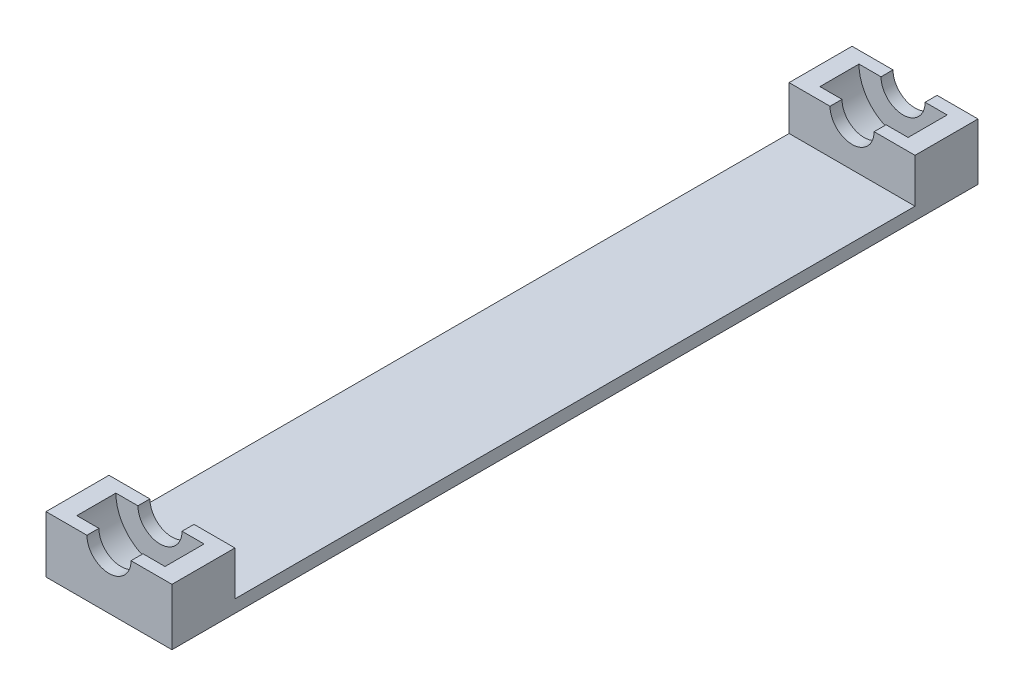
ISO-10303-21;
HEADER;
FILE_DESCRIPTION(('STEP AP214'),'2;1');
FILE_NAME('part.step','',(''),(''),'','','');
FILE_SCHEMA(('AUTOMOTIVE_DESIGN { 1 0 10303 214 1 1 1 1 }'));
ENDSEC;
DATA;
#1=APPLICATION_CONTEXT('core data for automotive mechanical design processes');
#2=APPLICATION_PROTOCOL_DEFINITION('international standard','automotive_design',2000,#1);
#3=PRODUCT_CONTEXT('',#1,'mechanical');
#4=PRODUCT('Part','Part','',(#3));
#5=PRODUCT_RELATED_PRODUCT_CATEGORY('part','',(#4));
#6=PRODUCT_DEFINITION_FORMATION('','',#4);
#7=PRODUCT_DEFINITION_CONTEXT('part definition',#1,'design');
#8=PRODUCT_DEFINITION('design','',#6,#7);
#9=PRODUCT_DEFINITION_SHAPE('','',#8);
#10=(LENGTH_UNIT() NAMED_UNIT(*) SI_UNIT(.MILLI.,.METRE.));
#11=(NAMED_UNIT(*) PLANE_ANGLE_UNIT() SI_UNIT($,.RADIAN.));
#12=(NAMED_UNIT(*) SI_UNIT($,.STERADIAN.) SOLID_ANGLE_UNIT());
#13=UNCERTAINTY_MEASURE_WITH_UNIT(LENGTH_MEASURE(1.E-05),#10,'distance_accuracy_value','');
#14=(GEOMETRIC_REPRESENTATION_CONTEXT(3) GLOBAL_UNCERTAINTY_ASSIGNED_CONTEXT((#13)) GLOBAL_UNIT_ASSIGNED_CONTEXT((#10,
#11,#12)) REPRESENTATION_CONTEXT('',''));
#15=CARTESIAN_POINT('',(0.,0.,0.));
#16=DIRECTION('',(0.,0.,1.));
#17=DIRECTION('',(1.,0.,0.));
#18=AXIS2_PLACEMENT_3D('',#15,#16,#17);
#19=CARTESIAN_POINT('',(10.,4.,0.));
#20=DIRECTION('',(0.,1.,0.));
#21=DIRECTION('',(0.,0.,1.));
#22=AXIS2_PLACEMENT_3D('',#19,#20,#21);
#23=PLANE('',#22);
#24=DIRECTION('',(-1.,0.,0.));
#25=VECTOR('',#24,1.);
#26=CARTESIAN_POINT('',(10.,4.,-32.));
#27=LINE('',#26,#25);
#28=CARTESIAN_POINT('',(10.,4.,-32.));
#29=VERTEX_POINT('',#28);
#30=CARTESIAN_POINT('',(6.74999999999996,4.,-32.));
#31=VERTEX_POINT('',#30);
#32=EDGE_CURVE('E167',#29,#31,#27,.T.);
#33=ORIENTED_EDGE('',*,*,#32,.T.);
#34=DIRECTION('',(0.,0.,-1.));
#35=VECTOR('',#34,1.);
#36=CARTESIAN_POINT('',(6.74999999999996,4.,-22.9));
#37=LINE('',#36,#35);
#38=CARTESIAN_POINT('',(6.74999999999996,4.,-31.05));
#39=VERTEX_POINT('',#38);
#40=EDGE_CURVE('E377',#31,#39,#37,.F.);
#41=ORIENTED_EDGE('',*,*,#40,.T.);
#42=DIRECTION('',(-1.,0.,0.));
#43=VECTOR('',#42,1.);
#44=CARTESIAN_POINT('',(10.,4.,-31.05));
#45=LINE('',#44,#43);
#46=CARTESIAN_POINT('',(8.49999999999996,4.,-31.05));
#47=VERTEX_POINT('',#46);
#48=EDGE_CURVE('E252',#47,#39,#45,.T.);
#49=ORIENTED_EDGE('',*,*,#48,.F.);
#50=DIRECTION('',(0.,0.,-1.));
#51=VECTOR('',#50,1.);
#52=CARTESIAN_POINT('',(8.49999999999996,4.,-27.95));
#53=LINE('',#52,#51);
#54=CARTESIAN_POINT('',(8.49999999999996,4.,-27.95));
#55=VERTEX_POINT('',#54);
#56=EDGE_CURVE('E11',#47,#55,#53,.F.);
#57=ORIENTED_EDGE('',*,*,#56,.T.);
#58=DIRECTION('',(-1.,0.,0.));
#59=VECTOR('',#58,1.);
#60=CARTESIAN_POINT('',(10.,4.,-27.95));
#61=LINE('',#60,#59);
#62=CARTESIAN_POINT('',(6.74999999999996,4.,-27.95));
#63=VERTEX_POINT('',#62);
#64=EDGE_CURVE('E51',#55,#63,#61,.T.);
#65=ORIENTED_EDGE('',*,*,#64,.T.);
#66=CARTESIAN_POINT('',(6.74999999999996,4.,-27.));
#67=VERTEX_POINT('',#66);
#68=EDGE_CURVE('E277',#63,#67,#37,.F.);
#69=ORIENTED_EDGE('',*,*,#68,.T.);
#70=DIRECTION('',(-1.,0.,0.));
#71=VECTOR('',#70,1.);
#72=CARTESIAN_POINT('',(10.,4.,-27.));
#73=LINE('',#72,#71);
#74=CARTESIAN_POINT('',(10.,4.,-27.));
#75=VERTEX_POINT('',#74);
#76=EDGE_CURVE('E203',#75,#67,#73,.T.);
#77=ORIENTED_EDGE('',*,*,#76,.F.);
#78=DIRECTION('',(0.,0.,-1.));
#79=VECTOR('',#78,1.);
#80=CARTESIAN_POINT('',(10.,4.,0.));
#81=LINE('',#80,#79);
#82=EDGE_CURVE('E179',#75,#29,#81,.T.);
#83=ORIENTED_EDGE('',*,*,#82,.T.);
#84=EDGE_LOOP('',(#33,#41,#49,#57,#65,#69,#77,#83));
#85=FACE_BOUND('',#84,.T.);
#86=ADVANCED_FACE('F41',(#85),#23,.T.);
#87=CARTESIAN_POINT('',(3.25000000000004,4.,-27.));
#88=VERTEX_POINT('',#87);
#89=CARTESIAN_POINT('',(0.,4.,-27.));
#90=VERTEX_POINT('',#89);
#91=EDGE_CURVE('E202',#88,#90,#73,.T.);
#92=ORIENTED_EDGE('',*,*,#91,.F.);
#93=DIRECTION('',(0.,0.,-1.));
#94=VECTOR('',#93,1.);
#95=CARTESIAN_POINT('',(3.25000000000004,4.,-22.9));
#96=LINE('',#95,#94);
#97=CARTESIAN_POINT('',(3.25000000000004,4.,-27.95));
#98=VERTEX_POINT('',#97);
#99=EDGE_CURVE('E437',#88,#98,#96,.T.);
#100=ORIENTED_EDGE('',*,*,#99,.T.);
#101=CARTESIAN_POINT('',(1.50000000000004,4.,-27.95));
#102=VERTEX_POINT('',#101);
#103=EDGE_CURVE('E251',#98,#102,#61,.T.);
#104=ORIENTED_EDGE('',*,*,#103,.T.);
#105=DIRECTION('',(0.,0.,-1.));
#106=VECTOR('',#105,1.);
#107=CARTESIAN_POINT('',(1.50000000000004,4.,-27.95));
#108=LINE('',#107,#106);
#109=CARTESIAN_POINT('',(1.50000000000004,4.,-31.05));
#110=VERTEX_POINT('',#109);
#111=EDGE_CURVE('E255',#102,#110,#108,.T.);
#112=ORIENTED_EDGE('',*,*,#111,.T.);
#113=CARTESIAN_POINT('',(3.25000000000004,4.,-31.05));
#114=VERTEX_POINT('',#113);
#115=EDGE_CURVE('E247',#114,#110,#45,.T.);
#116=ORIENTED_EDGE('',*,*,#115,.F.);
#117=CARTESIAN_POINT('',(3.25000000000004,4.,-32.));
#118=VERTEX_POINT('',#117);
#119=EDGE_CURVE('E431',#114,#118,#96,.T.);
#120=ORIENTED_EDGE('',*,*,#119,.T.);
#121=CARTESIAN_POINT('',(0.,4.,-32.));
#122=VERTEX_POINT('',#121);
#123=EDGE_CURVE('E207',#118,#122,#27,.T.);
#124=ORIENTED_EDGE('',*,*,#123,.T.);
#125=DIRECTION('',(0.,0.,-1.));
#126=VECTOR('',#125,1.);
#127=CARTESIAN_POINT('',(0.,4.,0.));
#128=LINE('',#127,#126);
#129=EDGE_CURVE('E191',#90,#122,#128,.T.);
#130=ORIENTED_EDGE('',*,*,#129,.F.);
#131=EDGE_LOOP('',(#92,#100,#104,#112,#116,#120,#124,#130));
#132=FACE_BOUND('',#131,.T.);
#133=ADVANCED_FACE('F430',(#132),#23,.T.);
#134=CARTESIAN_POINT('',(10.,3.99999999999996,0.));
#135=DIRECTION('',(0.,-1.,0.));
#136=DIRECTION('',(0.,0.,-1.));
#137=AXIS2_PLACEMENT_3D('',#134,#135,#136);
#138=PLANE('',#137);
#139=DIRECTION('',(-1.,0.,0.));
#140=VECTOR('',#139,1.);
#141=CARTESIAN_POINT('',(10.,3.99999999999999,27.));
#142=LINE('',#141,#140);
#143=CARTESIAN_POINT('',(10.,3.99999999999999,27.));
#144=VERTEX_POINT('',#143);
#145=CARTESIAN_POINT('',(6.74999999999996,3.99999999999999,27.));
#146=VERTEX_POINT('',#145);
#147=EDGE_CURVE('E123',#144,#146,#142,.T.);
#148=ORIENTED_EDGE('',*,*,#147,.T.);
#149=DIRECTION('',(0.,0.,1.));
#150=VECTOR('',#149,1.);
#151=CARTESIAN_POINT('',(6.74999999999996,3.99999999999999,22.9));
#152=LINE('',#151,#150);
#153=CARTESIAN_POINT('',(6.74999999999996,4.,27.95));
#154=VERTEX_POINT('',#153);
#155=EDGE_CURVE('E305',#146,#154,#152,.T.);
#156=ORIENTED_EDGE('',*,*,#155,.T.);
#157=DIRECTION('',(-1.,0.,0.));
#158=VECTOR('',#157,1.);
#159=CARTESIAN_POINT('',(10.,3.99999999999999,27.95));
#160=LINE('',#159,#158);
#161=CARTESIAN_POINT('',(8.49999999999996,3.99999999999999,27.95));
#162=VERTEX_POINT('',#161);
#163=EDGE_CURVE('E239',#162,#154,#160,.T.);
#164=ORIENTED_EDGE('',*,*,#163,.F.);
#165=DIRECTION('',(0.,0.,1.));
#166=VECTOR('',#165,1.);
#167=CARTESIAN_POINT('',(8.49999999999996,3.99999999999999,27.95));
#168=LINE('',#167,#166);
#169=CARTESIAN_POINT('',(8.49999999999996,4.,31.05));
#170=VERTEX_POINT('',#169);
#171=EDGE_CURVE('E243',#162,#170,#168,.T.);
#172=ORIENTED_EDGE('',*,*,#171,.T.);
#173=DIRECTION('',(-1.,0.,0.));
#174=VECTOR('',#173,1.);
#175=CARTESIAN_POINT('',(10.,4.,31.05));
#176=LINE('',#175,#174);
#177=CARTESIAN_POINT('',(6.74999999999996,4.,31.05));
#178=VERTEX_POINT('',#177);
#179=EDGE_CURVE('E235',#170,#178,#176,.T.);
#180=ORIENTED_EDGE('',*,*,#179,.T.);
#181=CARTESIAN_POINT('',(6.74999999999996,3.99999999999999,32.));
#182=VERTEX_POINT('',#181);
#183=EDGE_CURVE('E298',#178,#182,#152,.T.);
#184=ORIENTED_EDGE('',*,*,#183,.T.);
#185=DIRECTION('',(-1.,0.,0.));
#186=VECTOR('',#185,1.);
#187=CARTESIAN_POINT('',(10.,4.,32.));
#188=LINE('',#187,#186);
#189=CARTESIAN_POINT('',(10.,4.,32.));
#190=VERTEX_POINT('',#189);
#191=EDGE_CURVE('E143',#190,#182,#188,.T.);
#192=ORIENTED_EDGE('',*,*,#191,.F.);
#193=DIRECTION('',(0.,0.,1.));
#194=VECTOR('',#193,1.);
#195=CARTESIAN_POINT('',(10.,3.99999999999996,0.));
#196=LINE('',#195,#194);
#197=EDGE_CURVE('E139',#144,#190,#196,.T.);
#198=ORIENTED_EDGE('',*,*,#197,.F.);
#199=EDGE_LOOP('',(#148,#156,#164,#172,#180,#184,#192,#198));
#200=FACE_BOUND('',#199,.T.);
#201=ADVANCED_FACE('F140',(#200),#138,.F.);
#202=CARTESIAN_POINT('',(10.,0.,27.));
#203=DIRECTION('',(0.,0.,-1.));
#204=DIRECTION('',(-1.,0.,0.));
#205=AXIS2_PLACEMENT_3D('',#202,#203,#204);
#206=PLANE('',#205);
#207=CARTESIAN_POINT('',(5.,4.,27.));
#208=DIRECTION('',(0.,0.,-1.));
#209=DIRECTION('',(-1.,0.,0.));
#210=AXIS2_PLACEMENT_3D('',#207,#208,#209);
#211=CIRCLE('',#210,1.74999999999996);
#212=CARTESIAN_POINT('',(3.25000000000004,3.99999999999999,27.));
#213=VERTEX_POINT('',#212);
#214=EDGE_CURVE('E131',#146,#213,#211,.T.);
#215=ORIENTED_EDGE('',*,*,#214,.F.);
#216=ORIENTED_EDGE('',*,*,#147,.F.);
#217=DIRECTION('',(0.,-1.,0.));
#218=VECTOR('',#217,1.);
#219=CARTESIAN_POINT('',(10.,0.,27.));
#220=LINE('',#219,#218);
#221=CARTESIAN_POINT('',(10.,0.5,27.));
#222=VERTEX_POINT('',#221);
#223=EDGE_CURVE('E127',#144,#222,#220,.T.);
#224=ORIENTED_EDGE('',*,*,#223,.T.);
#225=DIRECTION('',(-1.,0.,0.));
#226=VECTOR('',#225,1.);
#227=CARTESIAN_POINT('',(10.,0.5,27.));
#228=LINE('',#227,#226);
#229=CARTESIAN_POINT('',(0.,0.5,27.));
#230=VERTEX_POINT('',#229);
#231=EDGE_CURVE('E59',#222,#230,#228,.T.);
#232=ORIENTED_EDGE('',*,*,#231,.T.);
#233=DIRECTION('',(0.,-1.,0.));
#234=VECTOR('',#233,1.);
#235=CARTESIAN_POINT('',(0.,0.,27.));
#236=LINE('',#235,#234);
#237=CARTESIAN_POINT('',(0.,3.99999999999999,27.));
#238=VERTEX_POINT('',#237);
#239=EDGE_CURVE('E163',#238,#230,#236,.T.);
#240=ORIENTED_EDGE('',*,*,#239,.F.);
#241=EDGE_CURVE('E136',#213,#238,#142,.T.);
#242=ORIENTED_EDGE('',*,*,#241,.F.);
#243=EDGE_LOOP('',(#215,#216,#224,#232,#240,#242));
#244=FACE_BOUND('',#243,.T.);
#245=ADVANCED_FACE('F125',(#244),#206,.T.);
#246=CARTESIAN_POINT('',(3.25000000000004,4.,32.));
#247=VERTEX_POINT('',#246);
#248=CARTESIAN_POINT('',(0.,4.,32.));
#249=VERTEX_POINT('',#248);
#250=EDGE_CURVE('E173',#247,#249,#188,.T.);
#251=ORIENTED_EDGE('',*,*,#250,.F.);
#252=DIRECTION('',(0.,0.,1.));
#253=VECTOR('',#252,1.);
#254=CARTESIAN_POINT('',(3.25000000000004,3.99999999999999,22.9));
#255=LINE('',#254,#253);
#256=CARTESIAN_POINT('',(3.25000000000004,4.,31.05));
#257=VERTEX_POINT('',#256);
#258=EDGE_CURVE('E314',#247,#257,#255,.F.);
#259=ORIENTED_EDGE('',*,*,#258,.T.);
#260=CARTESIAN_POINT('',(1.50000000000004,4.,31.05));
#261=VERTEX_POINT('',#260);
#262=EDGE_CURVE('E135',#257,#261,#176,.T.);
#263=ORIENTED_EDGE('',*,*,#262,.T.);
#264=DIRECTION('',(0.,0.,1.));
#265=VECTOR('',#264,1.);
#266=CARTESIAN_POINT('',(1.50000000000004,3.99999999999999,27.95));
#267=LINE('',#266,#265);
#268=CARTESIAN_POINT('',(1.50000000000004,3.99999999999999,27.95));
#269=VERTEX_POINT('',#268);
#270=EDGE_CURVE('E238',#261,#269,#267,.F.);
#271=ORIENTED_EDGE('',*,*,#270,.T.);
#272=CARTESIAN_POINT('',(3.25000000000004,3.99999999999999,27.95));
#273=VERTEX_POINT('',#272);
#274=EDGE_CURVE('E112',#273,#269,#160,.T.);
#275=ORIENTED_EDGE('',*,*,#274,.F.);
#276=EDGE_CURVE('E311',#273,#213,#255,.F.);
#277=ORIENTED_EDGE('',*,*,#276,.T.);
#278=ORIENTED_EDGE('',*,*,#241,.T.);
#279=DIRECTION('',(0.,0.,1.));
#280=VECTOR('',#279,1.);
#281=CARTESIAN_POINT('',(0.,3.99999999999996,0.));
#282=LINE('',#281,#280);
#283=EDGE_CURVE('E155',#238,#249,#282,.T.);
#284=ORIENTED_EDGE('',*,*,#283,.T.);
#285=EDGE_LOOP('',(#251,#259,#263,#271,#275,#277,#278,#284));
#286=FACE_BOUND('',#285,.T.);
#287=ADVANCED_FACE('F357',(#286),#138,.F.);
#288=CARTESIAN_POINT('',(10.,0.,32.));
#289=DIRECTION('',(0.,0.,-1.));
#290=DIRECTION('',(-1.,0.,0.));
#291=AXIS2_PLACEMENT_3D('',#288,#289,#290);
#292=PLANE('',#291);
#293=ORIENTED_EDGE('',*,*,#191,.T.);
#294=CARTESIAN_POINT('',(5.,4.,32.));
#295=DIRECTION('',(0.,0.,-1.));
#296=DIRECTION('',(-1.,0.,0.));
#297=AXIS2_PLACEMENT_3D('',#294,#295,#296);
#298=CIRCLE('',#297,1.74999999999996);
#299=EDGE_CURVE('E303',#182,#247,#298,.T.);
#300=ORIENTED_EDGE('',*,*,#299,.T.);
#301=ORIENTED_EDGE('',*,*,#250,.T.);
#302=DIRECTION('',(0.,-1.,0.));
#303=VECTOR('',#302,1.);
#304=CARTESIAN_POINT('',(0.,0.,32.));
#305=LINE('',#304,#303);
#306=CARTESIAN_POINT('',(0.,-0.5,32.));
#307=VERTEX_POINT('',#306);
#308=EDGE_CURVE('E102',#249,#307,#305,.T.);
#309=ORIENTED_EDGE('',*,*,#308,.T.);
#310=DIRECTION('',(-1.,0.,0.));
#311=VECTOR('',#310,1.);
#312=CARTESIAN_POINT('',(10.,-0.5,32.));
#313=LINE('',#312,#311);
#314=CARTESIAN_POINT('',(10.,-0.5,32.));
#315=VERTEX_POINT('',#314);
#316=EDGE_CURVE('E192',#315,#307,#313,.T.);
#317=ORIENTED_EDGE('',*,*,#316,.F.);
#318=DIRECTION('',(0.,-1.,0.));
#319=VECTOR('',#318,1.);
#320=CARTESIAN_POINT('',(10.,0.,32.));
#321=LINE('',#320,#319);
#322=EDGE_CURVE('E147',#190,#315,#321,.T.);
#323=ORIENTED_EDGE('',*,*,#322,.F.);
#324=EDGE_LOOP('',(#293,#300,#301,#309,#317,#323));
#325=FACE_BOUND('',#324,.T.);
#326=ADVANCED_FACE('F351',(#325),#292,.F.);
#327=CARTESIAN_POINT('',(10.,0.,0.));
#328=DIRECTION('',(1.,0.,0.));
#329=DIRECTION('',(0.,0.,-1.));
#330=AXIS2_PLACEMENT_3D('',#327,#328,#329);
#331=PLANE('',#330);
#332=ORIENTED_EDGE('',*,*,#223,.F.);
#333=ORIENTED_EDGE('',*,*,#197,.T.);
#334=ORIENTED_EDGE('',*,*,#322,.T.);
#335=DIRECTION('',(0.,0.,-1.));
#336=VECTOR('',#335,1.);
#337=CARTESIAN_POINT('',(10.,-0.5,32.));
#338=LINE('',#337,#336);
#339=CARTESIAN_POINT('',(10.,-0.5,-32.));
#340=VERTEX_POINT('',#339);
#341=EDGE_CURVE('E211',#315,#340,#338,.T.);
#342=ORIENTED_EDGE('',*,*,#341,.T.);
#343=DIRECTION('',(0.,-1.,0.));
#344=VECTOR('',#343,1.);
#345=CARTESIAN_POINT('',(10.,0.,-32.));
#346=LINE('',#345,#344);
#347=EDGE_CURVE('E176',#29,#340,#346,.T.);
#348=ORIENTED_EDGE('',*,*,#347,.F.);
#349=ORIENTED_EDGE('',*,*,#82,.F.);
#350=DIRECTION('',(0.,-1.,0.));
#351=VECTOR('',#350,1.);
#352=CARTESIAN_POINT('',(10.,0.,-27.));
#353=LINE('',#352,#351);
#354=CARTESIAN_POINT('',(10.,0.5,-27.));
#355=VERTEX_POINT('',#354);
#356=EDGE_CURVE('E184',#75,#355,#353,.T.);
#357=ORIENTED_EDGE('',*,*,#356,.T.);
#358=DIRECTION('',(0.,0.,-1.));
#359=VECTOR('',#358,1.);
#360=CARTESIAN_POINT('',(10.,0.5,32.));
#361=LINE('',#360,#359);
#362=EDGE_CURVE('E151',#222,#355,#361,.T.);
#363=ORIENTED_EDGE('',*,*,#362,.F.);
#364=EDGE_LOOP('',(#332,#333,#334,#342,#348,#349,#357,#363));
#365=FACE_BOUND('',#364,.T.);
#366=ADVANCED_FACE('F149',(#365),#331,.T.);
#367=CARTESIAN_POINT('',(0.,0.,0.));
#368=DIRECTION('',(1.,0.,0.));
#369=DIRECTION('',(0.,0.,-1.));
#370=AXIS2_PLACEMENT_3D('',#367,#368,#369);
#371=PLANE('',#370);
#372=ORIENTED_EDGE('',*,*,#239,.T.);
#373=DIRECTION('',(0.,0.,-1.));
#374=VECTOR('',#373,1.);
#375=CARTESIAN_POINT('',(0.,0.5,32.));
#376=LINE('',#375,#374);
#377=CARTESIAN_POINT('',(0.,0.5,-27.));
#378=VERTEX_POINT('',#377);
#379=EDGE_CURVE('E215',#230,#378,#376,.T.);
#380=ORIENTED_EDGE('',*,*,#379,.T.);
#381=DIRECTION('',(0.,-1.,0.));
#382=VECTOR('',#381,1.);
#383=CARTESIAN_POINT('',(0.,0.,-27.));
#384=LINE('',#383,#382);
#385=EDGE_CURVE('E180',#90,#378,#384,.T.);
#386=ORIENTED_EDGE('',*,*,#385,.F.);
#387=ORIENTED_EDGE('',*,*,#129,.T.);
#388=DIRECTION('',(0.,-1.,0.));
#389=VECTOR('',#388,1.);
#390=CARTESIAN_POINT('',(0.,0.,-32.));
#391=LINE('',#390,#389);
#392=CARTESIAN_POINT('',(0.,-0.5,-32.));
#393=VERTEX_POINT('',#392);
#394=EDGE_CURVE('E188',#122,#393,#391,.T.);
#395=ORIENTED_EDGE('',*,*,#394,.T.);
#396=DIRECTION('',(0.,0.,-1.));
#397=VECTOR('',#396,1.);
#398=CARTESIAN_POINT('',(0.,-0.5,32.));
#399=LINE('',#398,#397);
#400=EDGE_CURVE('E219',#307,#393,#399,.T.);
#401=ORIENTED_EDGE('',*,*,#400,.F.);
#402=ORIENTED_EDGE('',*,*,#308,.F.);
#403=ORIENTED_EDGE('',*,*,#283,.F.);
#404=EDGE_LOOP('',(#372,#380,#386,#387,#395,#401,#402,#403));
#405=FACE_BOUND('',#404,.T.);
#406=ADVANCED_FACE('F360',(#405),#371,.F.);
#407=CARTESIAN_POINT('',(10.,0.,-32.));
#408=DIRECTION('',(0.,0.,-1.));
#409=DIRECTION('',(-1.,0.,0.));
#410=AXIS2_PLACEMENT_3D('',#407,#408,#409);
#411=PLANE('',#410);
#412=ORIENTED_EDGE('',*,*,#123,.F.);
#413=CARTESIAN_POINT('',(5.,4.,-32.));
#414=DIRECTION('',(0.,0.,-1.));
#415=DIRECTION('',(-1.,0.,0.));
#416=AXIS2_PLACEMENT_3D('',#413,#414,#415);
#417=CIRCLE('',#416,1.74999999999996);
#418=EDGE_CURVE('E374',#118,#31,#417,.F.);
#419=ORIENTED_EDGE('',*,*,#418,.T.);
#420=ORIENTED_EDGE('',*,*,#32,.F.);
#421=ORIENTED_EDGE('',*,*,#347,.T.);
#422=DIRECTION('',(-1.,0.,0.));
#423=VECTOR('',#422,1.);
#424=CARTESIAN_POINT('',(10.,-0.5,-32.));
#425=LINE('',#424,#423);
#426=EDGE_CURVE('E218',#340,#393,#425,.T.);
#427=ORIENTED_EDGE('',*,*,#426,.T.);
#428=ORIENTED_EDGE('',*,*,#394,.F.);
#429=EDGE_LOOP('',(#412,#419,#420,#421,#427,#428));
#430=FACE_BOUND('',#429,.T.);
#431=ADVANCED_FACE('F370',(#430),#411,.T.);
#432=CARTESIAN_POINT('',(10.,0.,-27.));
#433=DIRECTION('',(0.,0.,-1.));
#434=DIRECTION('',(-1.,0.,0.));
#435=AXIS2_PLACEMENT_3D('',#432,#433,#434);
#436=PLANE('',#435);
#437=CARTESIAN_POINT('',(5.,4.,-27.));
#438=DIRECTION('',(0.,0.,-1.));
#439=DIRECTION('',(-1.,0.,0.));
#440=AXIS2_PLACEMENT_3D('',#437,#438,#439);
#441=CIRCLE('',#440,1.74999999999996);
#442=EDGE_CURVE('E425',#88,#67,#441,.F.);
#443=ORIENTED_EDGE('',*,*,#442,.F.);
#444=ORIENTED_EDGE('',*,*,#91,.T.);
#445=ORIENTED_EDGE('',*,*,#385,.T.);
#446=DIRECTION('',(-1.,0.,0.));
#447=VECTOR('',#446,1.);
#448=CARTESIAN_POINT('',(10.,0.5,-27.));
#449=LINE('',#448,#447);
#450=EDGE_CURVE('E187',#355,#378,#449,.T.);
#451=ORIENTED_EDGE('',*,*,#450,.F.);
#452=ORIENTED_EDGE('',*,*,#356,.F.);
#453=ORIENTED_EDGE('',*,*,#76,.T.);
#454=EDGE_LOOP('',(#443,#444,#445,#451,#452,#453));
#455=FACE_BOUND('',#454,.T.);
#456=ADVANCED_FACE('F423',(#455),#436,.F.);
#457=CARTESIAN_POINT('',(10.,-0.5,32.));
#458=DIRECTION('',(0.,1.,0.));
#459=DIRECTION('',(0.,0.,1.));
#460=AXIS2_PLACEMENT_3D('',#457,#458,#459);
#461=PLANE('',#460);
#462=ORIENTED_EDGE('',*,*,#400,.T.);
#463=ORIENTED_EDGE('',*,*,#426,.F.);
#464=ORIENTED_EDGE('',*,*,#341,.F.);
#465=ORIENTED_EDGE('',*,*,#316,.T.);
#466=EDGE_LOOP('',(#462,#463,#464,#465));
#467=FACE_BOUND('',#466,.T.);
#468=ADVANCED_FACE('F43',(#467),#461,.F.);
#469=CARTESIAN_POINT('',(10.,0.5,32.));
#470=DIRECTION('',(0.,1.,0.));
#471=DIRECTION('',(0.,0.,1.));
#472=AXIS2_PLACEMENT_3D('',#469,#470,#471);
#473=PLANE('',#472);
#474=ORIENTED_EDGE('',*,*,#231,.F.);
#475=ORIENTED_EDGE('',*,*,#362,.T.);
#476=ORIENTED_EDGE('',*,*,#450,.T.);
#477=ORIENTED_EDGE('',*,*,#379,.F.);
#478=EDGE_LOOP('',(#474,#475,#476,#477));
#479=FACE_BOUND('',#478,.T.);
#480=ADVANCED_FACE('F419',(#479),#473,.T.);
#481=CARTESIAN_POINT('',(5.,4.,27.95));
#482=DIRECTION('',(0.,0.,1.));
#483=DIRECTION('',(1.,0.,0.));
#484=AXIS2_PLACEMENT_3D('',#481,#482,#483);
#485=CYLINDRICAL_SURFACE('',#484,3.49999999999996);
#486=CARTESIAN_POINT('',(5.,4.,27.95));
#487=DIRECTION('',(0.,0.,1.));
#488=DIRECTION('',(1.,0.,0.));
#489=AXIS2_PLACEMENT_3D('',#486,#487,#488);
#490=CIRCLE('',#489,3.49999999999996);
#491=EDGE_CURVE('E223',#269,#162,#490,.T.);
#492=ORIENTED_EDGE('',*,*,#491,.F.);
#493=ORIENTED_EDGE('',*,*,#270,.F.);
#494=CARTESIAN_POINT('',(5.,4.,31.05));
#495=DIRECTION('',(0.,0.,1.));
#496=DIRECTION('',(1.,0.,0.));
#497=AXIS2_PLACEMENT_3D('',#494,#495,#496);
#498=CIRCLE('',#497,3.49999999999996);
#499=EDGE_CURVE('E158',#261,#170,#498,.T.);
#500=ORIENTED_EDGE('',*,*,#499,.T.);
#501=ORIENTED_EDGE('',*,*,#171,.F.);
#502=EDGE_LOOP('',(#492,#493,#500,#501));
#503=FACE_BOUND('',#502,.T.);
#504=ADVANCED_FACE('F337',(#503),#485,.F.);
#505=CARTESIAN_POINT('',(5.,4.,27.95));
#506=DIRECTION('',(0.,0.,1.));
#507=DIRECTION('',(1.,0.,0.));
#508=AXIS2_PLACEMENT_3D('',#505,#506,#507);
#509=PLANE('',#508);
#510=ORIENTED_EDGE('',*,*,#163,.T.);
#511=CARTESIAN_POINT('',(5.,4.,27.95));
#512=DIRECTION('',(0.,0.,1.));
#513=DIRECTION('',(1.,0.,0.));
#514=AXIS2_PLACEMENT_3D('',#511,#512,#513);
#515=CIRCLE('',#514,1.74999999999996);
#516=EDGE_CURVE('E321',#273,#154,#515,.T.);
#517=ORIENTED_EDGE('',*,*,#516,.F.);
#518=ORIENTED_EDGE('',*,*,#274,.T.);
#519=ORIENTED_EDGE('',*,*,#491,.T.);
#520=EDGE_LOOP('',(#510,#517,#518,#519));
#521=FACE_BOUND('',#520,.T.);
#522=ADVANCED_FACE('F469',(#521),#509,.T.);
#523=CARTESIAN_POINT('',(5.,4.,31.05));
#524=DIRECTION('',(0.,0.,1.));
#525=DIRECTION('',(1.,0.,0.));
#526=AXIS2_PLACEMENT_3D('',#523,#524,#525);
#527=PLANE('',#526);
#528=ORIENTED_EDGE('',*,*,#499,.F.);
#529=ORIENTED_EDGE('',*,*,#262,.F.);
#530=CARTESIAN_POINT('',(5.,4.,31.05));
#531=DIRECTION('',(0.,0.,1.));
#532=DIRECTION('',(1.,0.,0.));
#533=AXIS2_PLACEMENT_3D('',#530,#531,#532);
#534=CIRCLE('',#533,1.74999999999996);
#535=EDGE_CURVE('E325',#257,#178,#534,.T.);
#536=ORIENTED_EDGE('',*,*,#535,.T.);
#537=ORIENTED_EDGE('',*,*,#179,.F.);
#538=EDGE_LOOP('',(#528,#529,#536,#537));
#539=FACE_BOUND('',#538,.T.);
#540=ADVANCED_FACE('F412',(#539),#527,.F.);
#541=CARTESIAN_POINT('',(5.,4.,22.9));
#542=DIRECTION('',(0.,0.,1.));
#543=DIRECTION('',(1.,0.,0.));
#544=AXIS2_PLACEMENT_3D('',#541,#542,#543);
#545=CYLINDRICAL_SURFACE('',#544,1.74999999999996);
#546=ORIENTED_EDGE('',*,*,#299,.F.);
#547=ORIENTED_EDGE('',*,*,#183,.F.);
#548=ORIENTED_EDGE('',*,*,#535,.F.);
#549=ORIENTED_EDGE('',*,*,#258,.F.);
#550=EDGE_LOOP('',(#546,#547,#548,#549));
#551=FACE_BOUND('',#550,.T.);
#552=ADVANCED_FACE('F411',(#551),#545,.F.);
#553=ORIENTED_EDGE('',*,*,#214,.T.);
#554=ORIENTED_EDGE('',*,*,#276,.F.);
#555=ORIENTED_EDGE('',*,*,#516,.T.);
#556=ORIENTED_EDGE('',*,*,#155,.F.);
#557=EDGE_LOOP('',(#553,#554,#555,#556));
#558=FACE_BOUND('',#557,.T.);
#559=ADVANCED_FACE('F492',(#558),#545,.F.);
#560=CARTESIAN_POINT('',(5.,4.,-27.95));
#561=DIRECTION('',(0.,0.,-1.));
#562=DIRECTION('',(1.,0.,0.));
#563=AXIS2_PLACEMENT_3D('',#560,#561,#562);
#564=PLANE('',#563);
#565=CARTESIAN_POINT('',(5.,4.,-27.95));
#566=DIRECTION('',(0.,0.,1.));
#567=DIRECTION('',(1.,0.,0.));
#568=AXIS2_PLACEMENT_3D('',#565,#566,#567);
#569=CIRCLE('',#568,3.49999999999996);
#570=EDGE_CURVE('E289',#102,#55,#569,.T.);
#571=ORIENTED_EDGE('',*,*,#570,.F.);
#572=ORIENTED_EDGE('',*,*,#103,.F.);
#573=CARTESIAN_POINT('',(5.,4.,-27.95));
#574=DIRECTION('',(0.,0.,1.));
#575=DIRECTION('',(1.,0.,0.));
#576=AXIS2_PLACEMENT_3D('',#573,#574,#575);
#577=CIRCLE('',#576,1.74999999999996);
#578=EDGE_CURVE('E291',#98,#63,#577,.T.);
#579=ORIENTED_EDGE('',*,*,#578,.T.);
#580=ORIENTED_EDGE('',*,*,#64,.F.);
#581=EDGE_LOOP('',(#571,#572,#579,#580));
#582=FACE_BOUND('',#581,.T.);
#583=ADVANCED_FACE('F286',(#582),#564,.T.);
#584=CARTESIAN_POINT('',(5.,4.,-31.05));
#585=DIRECTION('',(0.,0.,-1.));
#586=DIRECTION('',(1.,0.,0.));
#587=AXIS2_PLACEMENT_3D('',#584,#585,#586);
#588=PLANE('',#587);
#589=ORIENTED_EDGE('',*,*,#48,.T.);
#590=CARTESIAN_POINT('',(5.,4.,-31.05));
#591=DIRECTION('',(0.,0.,1.));
#592=DIRECTION('',(1.,0.,0.));
#593=AXIS2_PLACEMENT_3D('',#590,#591,#592);
#594=CIRCLE('',#593,1.74999999999996);
#595=EDGE_CURVE('E308',#114,#39,#594,.T.);
#596=ORIENTED_EDGE('',*,*,#595,.F.);
#597=ORIENTED_EDGE('',*,*,#115,.T.);
#598=CARTESIAN_POINT('',(5.,4.,-31.05));
#599=DIRECTION('',(0.,0.,1.));
#600=DIRECTION('',(1.,0.,0.));
#601=AXIS2_PLACEMENT_3D('',#598,#599,#600);
#602=CIRCLE('',#601,3.49999999999996);
#603=EDGE_CURVE('E299',#110,#47,#602,.T.);
#604=ORIENTED_EDGE('',*,*,#603,.T.);
#605=EDGE_LOOP('',(#589,#596,#597,#604));
#606=FACE_BOUND('',#605,.T.);
#607=ADVANCED_FACE('F497',(#606),#588,.F.);
#608=CARTESIAN_POINT('',(5.,4.,-27.95));
#609=DIRECTION('',(0.,0.,-1.));
#610=DIRECTION('',(-1.,0.,0.));
#611=AXIS2_PLACEMENT_3D('',#608,#609,#610);
#612=CYLINDRICAL_SURFACE('',#611,3.49999999999996);
#613=ORIENTED_EDGE('',*,*,#603,.F.);
#614=ORIENTED_EDGE('',*,*,#111,.F.);
#615=ORIENTED_EDGE('',*,*,#570,.T.);
#616=ORIENTED_EDGE('',*,*,#56,.F.);
#617=EDGE_LOOP('',(#613,#614,#615,#616));
#618=FACE_BOUND('',#617,.T.);
#619=ADVANCED_FACE('F295',(#618),#612,.F.);
#620=CARTESIAN_POINT('',(5.,4.,-22.9));
#621=DIRECTION('',(0.,0.,-1.));
#622=DIRECTION('',(-1.,0.,0.));
#623=AXIS2_PLACEMENT_3D('',#620,#621,#622);
#624=CYLINDRICAL_SURFACE('',#623,1.74999999999996);
#625=ORIENTED_EDGE('',*,*,#418,.F.);
#626=ORIENTED_EDGE('',*,*,#119,.F.);
#627=ORIENTED_EDGE('',*,*,#595,.T.);
#628=ORIENTED_EDGE('',*,*,#40,.F.);
#629=EDGE_LOOP('',(#625,#626,#627,#628));
#630=FACE_BOUND('',#629,.T.);
#631=ADVANCED_FACE('F433',(#630),#624,.F.);
#632=ORIENTED_EDGE('',*,*,#578,.F.);
#633=ORIENTED_EDGE('',*,*,#99,.F.);
#634=ORIENTED_EDGE('',*,*,#442,.T.);
#635=ORIENTED_EDGE('',*,*,#68,.F.);
#636=EDGE_LOOP('',(#632,#633,#634,#635));
#637=FACE_BOUND('',#636,.T.);
#638=ADVANCED_FACE('F448',(#637),#624,.F.);
#639=CLOSED_SHELL('',(#86,#133,#201,#245,#287,#326,#366,#406,#431,#456,#468,#480,#504,#522,#540,
#552,#559,#583,#607,#619,#631,#638));
#640=MANIFOLD_SOLID_BREP('B2',#639);
#641=ADVANCED_BREP_SHAPE_REPRESENTATION('',(#18,#640),#14);
#642=SHAPE_DEFINITION_REPRESENTATION(#9,#641);
ENDSEC;
END-ISO-10303-21;
